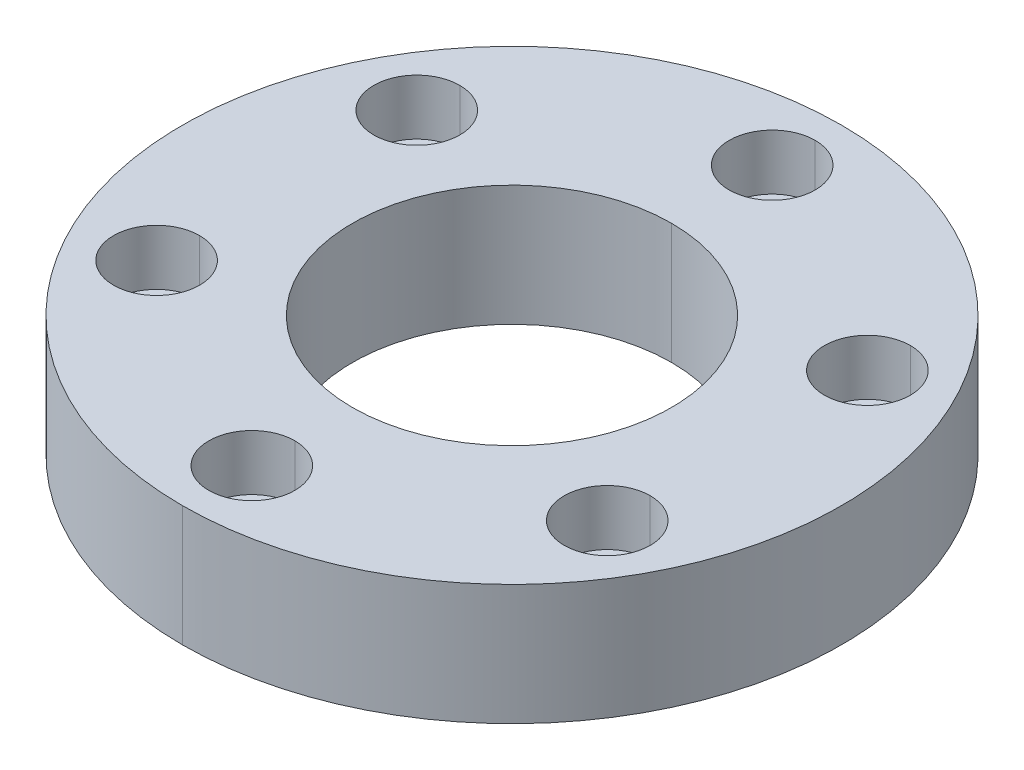
ISO-10303-21;
HEADER;
FILE_DESCRIPTION(('STEP AP214'),'2;1');
FILE_NAME('part.step','',(''),(''),'','','');
FILE_SCHEMA(('AUTOMOTIVE_DESIGN { 1 0 10303 214 1 1 1 1 }'));
ENDSEC;
DATA;
#1=APPLICATION_CONTEXT('core data for automotive mechanical design processes');
#2=APPLICATION_PROTOCOL_DEFINITION('international standard','automotive_design',2000,#1);
#3=PRODUCT_CONTEXT('',#1,'mechanical');
#4=PRODUCT('Part','Part','',(#3));
#5=PRODUCT_RELATED_PRODUCT_CATEGORY('part','',(#4));
#6=PRODUCT_DEFINITION_FORMATION('','',#4);
#7=PRODUCT_DEFINITION_CONTEXT('part definition',#1,'design');
#8=PRODUCT_DEFINITION('design','',#6,#7);
#9=PRODUCT_DEFINITION_SHAPE('','',#8);
#10=(LENGTH_UNIT() NAMED_UNIT(*) SI_UNIT(.MILLI.,.METRE.));
#11=(NAMED_UNIT(*) PLANE_ANGLE_UNIT() SI_UNIT($,.RADIAN.));
#12=(NAMED_UNIT(*) SI_UNIT($,.STERADIAN.) SOLID_ANGLE_UNIT());
#13=UNCERTAINTY_MEASURE_WITH_UNIT(LENGTH_MEASURE(1.E-05),#10,'distance_accuracy_value','');
#14=(GEOMETRIC_REPRESENTATION_CONTEXT(3) GLOBAL_UNCERTAINTY_ASSIGNED_CONTEXT((#13)) GLOBAL_UNIT_ASSIGNED_CONTEXT((#10,
#11,#12)) REPRESENTATION_CONTEXT('',''));
#15=CARTESIAN_POINT('',(0.,0.,0.));
#16=DIRECTION('',(0.,0.,1.));
#17=DIRECTION('',(1.,0.,0.));
#18=AXIS2_PLACEMENT_3D('',#15,#16,#17);
#19=CARTESIAN_POINT('',(0.,5.9563,-23.8125));
#20=DIRECTION('',(0.,1.,0.));
#21=DIRECTION('',(1.,0.,0.));
#22=AXIS2_PLACEMENT_3D('',#19,#20,#21);
#23=PLANE('',#22);
#24=CARTESIAN_POINT('',(0.,5.9563,-23.8125));
#25=DIRECTION('',(0.,1.,0.));
#26=DIRECTION('',(0.,0.,1.));
#27=AXIS2_PLACEMENT_3D('',#24,#25,#26);
#28=CIRCLE('',#27,3.937);
#29=CARTESIAN_POINT('',(0.,5.9563,-19.8755));
#30=VERTEX_POINT('',#29);
#31=CARTESIAN_POINT('',(0.,5.9563,-27.7495));
#32=VERTEX_POINT('',#31);
#33=EDGE_CURVE('E10',#30,#32,#28,.T.);
#34=ORIENTED_EDGE('',*,*,#33,.T.);
#35=CARTESIAN_POINT('',(0.,5.9563,-23.8125));
#36=DIRECTION('',(0.,1.,0.));
#37=DIRECTION('',(0.,0.,1.));
#38=AXIS2_PLACEMENT_3D('',#35,#36,#37);
#39=CIRCLE('',#38,3.937);
#40=EDGE_CURVE('E346',#32,#30,#39,.T.);
#41=ORIENTED_EDGE('',*,*,#40,.T.);
#42=EDGE_LOOP('',(#34,#41));
#43=FACE_BOUND('',#42,.T.);
#44=ADVANCED_FACE('F16',(#43),#23,.T.);
#45=CARTESIAN_POINT('',(0.,5.9563,-23.8125));
#46=DIRECTION('',(0.,1.,0.));
#47=DIRECTION('',(0.,0.,1.));
#48=AXIS2_PLACEMENT_3D('',#45,#46,#47);
#49=CYLINDRICAL_SURFACE('',#48,3.937);
#50=DIRECTION('',(0.,1.,0.));
#51=VECTOR('',#50,1.);
#52=CARTESIAN_POINT('',(0.,5.9563,-27.7495));
#53=LINE('',#52,#51);
#54=CARTESIAN_POINT('',(0.,11.0363,-27.7495));
#55=VERTEX_POINT('',#54);
#56=EDGE_CURVE('E218',#32,#55,#53,.T.);
#57=ORIENTED_EDGE('',*,*,#56,.F.);
#58=ORIENTED_EDGE('',*,*,#33,.F.);
#59=DIRECTION('',(0.,1.,0.));
#60=VECTOR('',#59,1.);
#61=CARTESIAN_POINT('',(0.,5.9563,-19.8755));
#62=LINE('',#61,#60);
#63=CARTESIAN_POINT('',(0.,11.0363,-19.8755));
#64=VERTEX_POINT('',#63);
#65=EDGE_CURVE('E205',#30,#64,#62,.T.);
#66=ORIENTED_EDGE('',*,*,#65,.T.);
#67=CARTESIAN_POINT('',(0.,11.0363,-23.8125));
#68=DIRECTION('',(0.,1.,0.));
#69=DIRECTION('',(0.,0.,1.));
#70=AXIS2_PLACEMENT_3D('',#67,#68,#69);
#71=CIRCLE('',#70,3.937);
#72=EDGE_CURVE('E82',#64,#55,#71,.T.);
#73=ORIENTED_EDGE('',*,*,#72,.T.);
#74=EDGE_LOOP('',(#57,#58,#66,#73));
#75=FACE_BOUND('',#74,.T.);
#76=ADVANCED_FACE('F409',(#75),#49,.F.);
#77=CARTESIAN_POINT('',(-20.6222299276169,5.9563,-11.90625));
#78=DIRECTION('',(0.,1.,0.));
#79=DIRECTION('',(1.,0.,0.));
#80=AXIS2_PLACEMENT_3D('',#77,#78,#79);
#81=PLANE('',#80);
#82=CARTESIAN_POINT('',(-20.6222299276169,5.9563,-11.90625));
#83=DIRECTION('',(0.,1.,0.));
#84=DIRECTION('',(0.,0.,1.));
#85=AXIS2_PLACEMENT_3D('',#82,#83,#84);
#86=CIRCLE('',#85,3.937);
#87=CARTESIAN_POINT('',(-20.6222299276169,5.9563,-7.96925));
#88=VERTEX_POINT('',#87);
#89=CARTESIAN_POINT('',(-20.6222299276169,5.9563,-15.84325));
#90=VERTEX_POINT('',#89);
#91=EDGE_CURVE('E27',#88,#90,#86,.T.);
#92=ORIENTED_EDGE('',*,*,#91,.T.);
#93=CARTESIAN_POINT('',(-20.6222299276169,5.9563,-11.90625));
#94=DIRECTION('',(0.,1.,0.));
#95=DIRECTION('',(0.,0.,1.));
#96=AXIS2_PLACEMENT_3D('',#93,#94,#95);
#97=CIRCLE('',#96,3.937);
#98=EDGE_CURVE('E197',#90,#88,#97,.T.);
#99=ORIENTED_EDGE('',*,*,#98,.T.);
#100=EDGE_LOOP('',(#92,#99));
#101=FACE_BOUND('',#100,.T.);
#102=ADVANCED_FACE('F203',(#101),#81,.T.);
#103=CARTESIAN_POINT('',(-20.6222299276169,5.9563,-11.90625));
#104=DIRECTION('',(0.,1.,0.));
#105=DIRECTION('',(0.,0.,1.));
#106=AXIS2_PLACEMENT_3D('',#103,#104,#105);
#107=CYLINDRICAL_SURFACE('',#106,3.937);
#108=DIRECTION('',(0.,1.,0.));
#109=VECTOR('',#108,1.);
#110=CARTESIAN_POINT('',(-20.6222299276169,5.9563,-15.84325));
#111=LINE('',#110,#109);
#112=CARTESIAN_POINT('',(-20.6222299276169,11.0363,-15.84325));
#113=VERTEX_POINT('',#112);
#114=EDGE_CURVE('E188',#90,#113,#111,.T.);
#115=ORIENTED_EDGE('',*,*,#114,.F.);
#116=ORIENTED_EDGE('',*,*,#91,.F.);
#117=DIRECTION('',(0.,1.,0.));
#118=VECTOR('',#117,1.);
#119=CARTESIAN_POINT('',(-20.6222299276169,5.9563,-7.96925));
#120=LINE('',#119,#118);
#121=CARTESIAN_POINT('',(-20.6222299276169,11.0363,-7.96925));
#122=VERTEX_POINT('',#121);
#123=EDGE_CURVE('E185',#88,#122,#120,.T.);
#124=ORIENTED_EDGE('',*,*,#123,.T.);
#125=CARTESIAN_POINT('',(-20.6222299276169,11.0363,-11.90625));
#126=DIRECTION('',(0.,1.,0.));
#127=DIRECTION('',(0.,0.,1.));
#128=AXIS2_PLACEMENT_3D('',#125,#126,#127);
#129=CIRCLE('',#128,3.937);
#130=EDGE_CURVE('E243',#122,#113,#129,.T.);
#131=ORIENTED_EDGE('',*,*,#130,.T.);
#132=EDGE_LOOP('',(#115,#116,#124,#131));
#133=FACE_BOUND('',#132,.T.);
#134=ADVANCED_FACE('F18',(#133),#107,.F.);
#135=CARTESIAN_POINT('',(-20.6222299276169,5.9563,11.90625));
#136=DIRECTION('',(0.,1.,0.));
#137=DIRECTION('',(1.,0.,0.));
#138=AXIS2_PLACEMENT_3D('',#135,#136,#137);
#139=PLANE('',#138);
#140=CARTESIAN_POINT('',(-20.6222299276169,5.9563,11.90625));
#141=DIRECTION('',(0.,1.,0.));
#142=DIRECTION('',(0.,0.,1.));
#143=AXIS2_PLACEMENT_3D('',#140,#141,#142);
#144=CIRCLE('',#143,3.937);
#145=CARTESIAN_POINT('',(-20.6222299276169,5.9563,15.84325));
#146=VERTEX_POINT('',#145);
#147=CARTESIAN_POINT('',(-20.6222299276169,5.9563,7.96925));
#148=VERTEX_POINT('',#147);
#149=EDGE_CURVE('E193',#146,#148,#144,.T.);
#150=ORIENTED_EDGE('',*,*,#149,.T.);
#151=CARTESIAN_POINT('',(-20.6222299276169,5.9563,11.90625));
#152=DIRECTION('',(0.,1.,0.));
#153=DIRECTION('',(0.,0.,1.));
#154=AXIS2_PLACEMENT_3D('',#151,#152,#153);
#155=CIRCLE('',#154,3.937);
#156=EDGE_CURVE('E201',#148,#146,#155,.T.);
#157=ORIENTED_EDGE('',*,*,#156,.T.);
#158=EDGE_LOOP('',(#150,#157));
#159=FACE_BOUND('',#158,.T.);
#160=ADVANCED_FACE('F550',(#159),#139,.T.);
#161=CARTESIAN_POINT('',(-20.6222299276169,5.9563,11.90625));
#162=DIRECTION('',(0.,1.,0.));
#163=DIRECTION('',(0.,0.,1.));
#164=AXIS2_PLACEMENT_3D('',#161,#162,#163);
#165=CYLINDRICAL_SURFACE('',#164,3.937);
#166=DIRECTION('',(0.,1.,0.));
#167=VECTOR('',#166,1.);
#168=CARTESIAN_POINT('',(-20.6222299276169,5.9563,7.96925));
#169=LINE('',#168,#167);
#170=CARTESIAN_POINT('',(-20.6222299276169,11.0363,7.96925));
#171=VERTEX_POINT('',#170);
#172=EDGE_CURVE('E237',#148,#171,#169,.T.);
#173=ORIENTED_EDGE('',*,*,#172,.F.);
#174=ORIENTED_EDGE('',*,*,#149,.F.);
#175=DIRECTION('',(0.,1.,0.));
#176=VECTOR('',#175,1.);
#177=CARTESIAN_POINT('',(-20.6222299276169,5.9563,15.84325));
#178=LINE('',#177,#176);
#179=CARTESIAN_POINT('',(-20.6222299276169,11.0363,15.84325));
#180=VERTEX_POINT('',#179);
#181=EDGE_CURVE('E236',#146,#180,#178,.T.);
#182=ORIENTED_EDGE('',*,*,#181,.T.);
#183=CARTESIAN_POINT('',(-20.6222299276169,11.0363,11.90625));
#184=DIRECTION('',(0.,1.,0.));
#185=DIRECTION('',(0.,0.,1.));
#186=AXIS2_PLACEMENT_3D('',#183,#184,#185);
#187=CIRCLE('',#186,3.937);
#188=EDGE_CURVE('E246',#180,#171,#187,.T.);
#189=ORIENTED_EDGE('',*,*,#188,.T.);
#190=EDGE_LOOP('',(#173,#174,#182,#189));
#191=FACE_BOUND('',#190,.T.);
#192=ADVANCED_FACE('F554',(#191),#165,.F.);
#193=CARTESIAN_POINT('',(0.,5.9563,23.8125));
#194=DIRECTION('',(0.,1.,0.));
#195=DIRECTION('',(1.,0.,0.));
#196=AXIS2_PLACEMENT_3D('',#193,#194,#195);
#197=PLANE('',#196);
#198=CARTESIAN_POINT('',(0.,5.9563,23.8125));
#199=DIRECTION('',(0.,1.,0.));
#200=DIRECTION('',(0.,0.,1.));
#201=AXIS2_PLACEMENT_3D('',#198,#199,#200);
#202=CIRCLE('',#201,3.937);
#203=CARTESIAN_POINT('',(0.,5.9563,27.7495));
#204=VERTEX_POINT('',#203);
#205=CARTESIAN_POINT('',(0.,5.9563,19.8755));
#206=VERTEX_POINT('',#205);
#207=EDGE_CURVE('E222',#204,#206,#202,.T.);
#208=ORIENTED_EDGE('',*,*,#207,.T.);
#209=CARTESIAN_POINT('',(0.,5.9563,23.8125));
#210=DIRECTION('',(0.,1.,0.));
#211=DIRECTION('',(0.,0.,1.));
#212=AXIS2_PLACEMENT_3D('',#209,#210,#211);
#213=CIRCLE('',#212,3.937);
#214=EDGE_CURVE('E299',#206,#204,#213,.T.);
#215=ORIENTED_EDGE('',*,*,#214,.T.);
#216=EDGE_LOOP('',(#208,#215));
#217=FACE_BOUND('',#216,.T.);
#218=ADVANCED_FACE('F590',(#217),#197,.T.);
#219=CARTESIAN_POINT('',(0.,5.9563,23.8125));
#220=DIRECTION('',(0.,1.,0.));
#221=DIRECTION('',(0.,0.,1.));
#222=AXIS2_PLACEMENT_3D('',#219,#220,#221);
#223=CYLINDRICAL_SURFACE('',#222,3.937);
#224=DIRECTION('',(0.,1.,0.));
#225=VECTOR('',#224,1.);
#226=CARTESIAN_POINT('',(0.,5.9563,19.8755));
#227=LINE('',#226,#225);
#228=CARTESIAN_POINT('',(0.,11.0363,19.8755));
#229=VERTEX_POINT('',#228);
#230=EDGE_CURVE('E228',#206,#229,#227,.T.);
#231=ORIENTED_EDGE('',*,*,#230,.F.);
#232=ORIENTED_EDGE('',*,*,#207,.F.);
#233=DIRECTION('',(0.,1.,0.));
#234=VECTOR('',#233,1.);
#235=CARTESIAN_POINT('',(0.,5.9563,27.7495));
#236=LINE('',#235,#234);
#237=CARTESIAN_POINT('',(0.,11.0363,27.7495));
#238=VERTEX_POINT('',#237);
#239=EDGE_CURVE('E227',#204,#238,#236,.T.);
#240=ORIENTED_EDGE('',*,*,#239,.T.);
#241=CARTESIAN_POINT('',(0.,11.0363,23.8125));
#242=DIRECTION('',(0.,1.,0.));
#243=DIRECTION('',(0.,0.,1.));
#244=AXIS2_PLACEMENT_3D('',#241,#242,#243);
#245=CIRCLE('',#244,3.937);
#246=EDGE_CURVE('E231',#238,#229,#245,.T.);
#247=ORIENTED_EDGE('',*,*,#246,.T.);
#248=EDGE_LOOP('',(#231,#232,#240,#247));
#249=FACE_BOUND('',#248,.T.);
#250=ADVANCED_FACE('F424',(#249),#223,.F.);
#251=CARTESIAN_POINT('',(20.6222299276169,5.9563,11.90625));
#252=DIRECTION('',(0.,1.,0.));
#253=DIRECTION('',(1.,0.,0.));
#254=AXIS2_PLACEMENT_3D('',#251,#252,#253);
#255=PLANE('',#254);
#256=CARTESIAN_POINT('',(20.6222299276169,5.9563,11.90625));
#257=DIRECTION('',(0.,1.,0.));
#258=DIRECTION('',(0.,0.,1.));
#259=AXIS2_PLACEMENT_3D('',#256,#257,#258);
#260=CIRCLE('',#259,3.937);
#261=CARTESIAN_POINT('',(20.6222299276169,5.9563,15.84325));
#262=VERTEX_POINT('',#261);
#263=CARTESIAN_POINT('',(20.6222299276169,5.9563,7.96925));
#264=VERTEX_POINT('',#263);
#265=EDGE_CURVE('E163',#262,#264,#260,.T.);
#266=ORIENTED_EDGE('',*,*,#265,.T.);
#267=CARTESIAN_POINT('',(20.6222299276169,5.9563,11.90625));
#268=DIRECTION('',(0.,1.,0.));
#269=DIRECTION('',(0.,0.,1.));
#270=AXIS2_PLACEMENT_3D('',#267,#268,#269);
#271=CIRCLE('',#270,3.937);
#272=EDGE_CURVE('E250',#264,#262,#271,.T.);
#273=ORIENTED_EDGE('',*,*,#272,.T.);
#274=EDGE_LOOP('',(#266,#273));
#275=FACE_BOUND('',#274,.T.);
#276=ADVANCED_FACE('F420',(#275),#255,.T.);
#277=CARTESIAN_POINT('',(20.6222299276169,5.9563,11.90625));
#278=DIRECTION('',(0.,1.,0.));
#279=DIRECTION('',(0.,0.,1.));
#280=AXIS2_PLACEMENT_3D('',#277,#278,#279);
#281=CYLINDRICAL_SURFACE('',#280,3.937);
#282=DIRECTION('',(0.,1.,0.));
#283=VECTOR('',#282,1.);
#284=CARTESIAN_POINT('',(20.6222299276169,5.9563,7.96925));
#285=LINE('',#284,#283);
#286=CARTESIAN_POINT('',(20.6222299276169,11.0363,7.96925));
#287=VERTEX_POINT('',#286);
#288=EDGE_CURVE('E281',#264,#287,#285,.T.);
#289=ORIENTED_EDGE('',*,*,#288,.F.);
#290=ORIENTED_EDGE('',*,*,#265,.F.);
#291=DIRECTION('',(0.,1.,0.));
#292=VECTOR('',#291,1.);
#293=CARTESIAN_POINT('',(20.6222299276169,5.9563,15.84325));
#294=LINE('',#293,#292);
#295=CARTESIAN_POINT('',(20.6222299276169,11.0363,15.84325));
#296=VERTEX_POINT('',#295);
#297=EDGE_CURVE('E238',#262,#296,#294,.T.);
#298=ORIENTED_EDGE('',*,*,#297,.T.);
#299=CARTESIAN_POINT('',(20.6222299276169,11.0363,11.90625));
#300=DIRECTION('',(0.,1.,0.));
#301=DIRECTION('',(0.,0.,1.));
#302=AXIS2_PLACEMENT_3D('',#299,#300,#301);
#303=CIRCLE('',#302,3.937);
#304=EDGE_CURVE('E152',#296,#287,#303,.T.);
#305=ORIENTED_EDGE('',*,*,#304,.T.);
#306=EDGE_LOOP('',(#289,#290,#298,#305));
#307=FACE_BOUND('',#306,.T.);
#308=ADVANCED_FACE('F423',(#307),#281,.F.);
#309=CARTESIAN_POINT('',(20.6222299276169,5.9563,-11.90625));
#310=DIRECTION('',(0.,1.,0.));
#311=DIRECTION('',(1.,0.,0.));
#312=AXIS2_PLACEMENT_3D('',#309,#310,#311);
#313=PLANE('',#312);
#314=CARTESIAN_POINT('',(20.6222299276169,5.9563,-11.90625));
#315=DIRECTION('',(0.,1.,0.));
#316=DIRECTION('',(0.,0.,1.));
#317=AXIS2_PLACEMENT_3D('',#314,#315,#316);
#318=CIRCLE('',#317,3.937);
#319=CARTESIAN_POINT('',(20.6222299276169,5.9563,-7.96925));
#320=VERTEX_POINT('',#319);
#321=CARTESIAN_POINT('',(20.6222299276169,5.9563,-15.84325));
#322=VERTEX_POINT('',#321);
#323=EDGE_CURVE('E264',#320,#322,#318,.T.);
#324=ORIENTED_EDGE('',*,*,#323,.T.);
#325=CARTESIAN_POINT('',(20.6222299276169,5.9563,-11.90625));
#326=DIRECTION('',(0.,1.,0.));
#327=DIRECTION('',(0.,0.,1.));
#328=AXIS2_PLACEMENT_3D('',#325,#326,#327);
#329=CIRCLE('',#328,3.937);
#330=EDGE_CURVE('E241',#322,#320,#329,.T.);
#331=ORIENTED_EDGE('',*,*,#330,.T.);
#332=EDGE_LOOP('',(#324,#331));
#333=FACE_BOUND('',#332,.T.);
#334=ADVANCED_FACE('F434',(#333),#313,.T.);
#335=CARTESIAN_POINT('',(20.6222299276169,5.9563,-11.90625));
#336=DIRECTION('',(0.,1.,0.));
#337=DIRECTION('',(0.,0.,1.));
#338=AXIS2_PLACEMENT_3D('',#335,#336,#337);
#339=CYLINDRICAL_SURFACE('',#338,3.937);
#340=DIRECTION('',(0.,1.,0.));
#341=VECTOR('',#340,1.);
#342=CARTESIAN_POINT('',(20.6222299276169,5.9563,-15.84325));
#343=LINE('',#342,#341);
#344=CARTESIAN_POINT('',(20.6222299276169,11.0363,-15.84325));
#345=VERTEX_POINT('',#344);
#346=EDGE_CURVE('E254',#322,#345,#343,.T.);
#347=ORIENTED_EDGE('',*,*,#346,.F.);
#348=ORIENTED_EDGE('',*,*,#323,.F.);
#349=DIRECTION('',(0.,1.,0.));
#350=VECTOR('',#349,1.);
#351=CARTESIAN_POINT('',(20.6222299276169,5.9563,-7.96925));
#352=LINE('',#351,#350);
#353=CARTESIAN_POINT('',(20.6222299276169,11.0363,-7.96925));
#354=VERTEX_POINT('',#353);
#355=EDGE_CURVE('E255',#320,#354,#352,.T.);
#356=ORIENTED_EDGE('',*,*,#355,.T.);
#357=CARTESIAN_POINT('',(20.6222299276169,11.0363,-11.90625));
#358=DIRECTION('',(0.,1.,0.));
#359=DIRECTION('',(0.,0.,1.));
#360=AXIS2_PLACEMENT_3D('',#357,#358,#359);
#361=CIRCLE('',#360,3.937);
#362=EDGE_CURVE('E112',#354,#345,#361,.T.);
#363=ORIENTED_EDGE('',*,*,#362,.T.);
#364=EDGE_LOOP('',(#347,#348,#356,#363));
#365=FACE_BOUND('',#364,.T.);
#366=ADVANCED_FACE('F438',(#365),#339,.F.);
#367=CARTESIAN_POINT('',(0.,11.0363,0.));
#368=DIRECTION('',(0.,-1.,0.));
#369=DIRECTION('',(0.,0.,-1.));
#370=AXIS2_PLACEMENT_3D('',#367,#368,#369);
#371=CYLINDRICAL_SURFACE('',#370,14.605);
#372=DIRECTION('',(0.,-1.,0.));
#373=VECTOR('',#372,1.);
#374=CARTESIAN_POINT('',(0.,11.0363,14.605));
#375=LINE('',#374,#373);
#376=CARTESIAN_POINT('',(0.,11.0363,14.605));
#377=VERTEX_POINT('',#376);
#378=CARTESIAN_POINT('',(0.,0.,14.605));
#379=VERTEX_POINT('',#378);
#380=EDGE_CURVE('E263',#377,#379,#375,.T.);
#381=ORIENTED_EDGE('',*,*,#380,.F.);
#382=CARTESIAN_POINT('',(0.,11.0363,0.));
#383=DIRECTION('',(0.,1.,0.));
#384=DIRECTION('',(0.,0.,1.));
#385=AXIS2_PLACEMENT_3D('',#382,#383,#384);
#386=CIRCLE('',#385,14.605);
#387=CARTESIAN_POINT('',(0.,11.0363,-14.605));
#388=VERTEX_POINT('',#387);
#389=EDGE_CURVE('E303',#377,#388,#386,.T.);
#390=ORIENTED_EDGE('',*,*,#389,.T.);
#391=DIRECTION('',(0.,-1.,0.));
#392=VECTOR('',#391,1.);
#393=CARTESIAN_POINT('',(0.,11.0363,-14.605));
#394=LINE('',#393,#392);
#395=CARTESIAN_POINT('',(0.,0.,-14.605));
#396=VERTEX_POINT('',#395);
#397=EDGE_CURVE('E291',#388,#396,#394,.T.);
#398=ORIENTED_EDGE('',*,*,#397,.T.);
#399=CARTESIAN_POINT('',(0.,0.,0.));
#400=DIRECTION('',(0.,1.,0.));
#401=DIRECTION('',(0.,0.,1.));
#402=AXIS2_PLACEMENT_3D('',#399,#400,#401);
#403=CIRCLE('',#402,14.605);
#404=EDGE_CURVE('E20',#379,#396,#403,.T.);
#405=ORIENTED_EDGE('',*,*,#404,.F.);
#406=EDGE_LOOP('',(#381,#390,#398,#405));
#407=FACE_BOUND('',#406,.T.);
#408=ADVANCED_FACE('F581',(#407),#371,.F.);
#409=CARTESIAN_POINT('',(0.,11.0363,0.));
#410=DIRECTION('',(0.,-1.,0.));
#411=DIRECTION('',(0.,0.,-1.));
#412=AXIS2_PLACEMENT_3D('',#409,#410,#411);
#413=CYLINDRICAL_SURFACE('',#412,30.1625);
#414=DIRECTION('',(0.,-1.,0.));
#415=VECTOR('',#414,1.);
#416=CARTESIAN_POINT('',(0.,11.0363,30.1625));
#417=LINE('',#416,#415);
#418=CARTESIAN_POINT('',(0.,11.0363,30.1625));
#419=VERTEX_POINT('',#418);
#420=CARTESIAN_POINT('',(0.,0.,30.1625));
#421=VERTEX_POINT('',#420);
#422=EDGE_CURVE('E273',#419,#421,#417,.T.);
#423=ORIENTED_EDGE('',*,*,#422,.F.);
#424=CARTESIAN_POINT('',(0.,11.0363,0.));
#425=DIRECTION('',(0.,1.,0.));
#426=DIRECTION('',(0.,0.,1.));
#427=AXIS2_PLACEMENT_3D('',#424,#425,#426);
#428=CIRCLE('',#427,30.1625);
#429=CARTESIAN_POINT('',(0.,11.0363,-30.1625));
#430=VERTEX_POINT('',#429);
#431=EDGE_CURVE('E325',#430,#419,#428,.T.);
#432=ORIENTED_EDGE('',*,*,#431,.F.);
#433=DIRECTION('',(0.,-1.,0.));
#434=VECTOR('',#433,1.);
#435=CARTESIAN_POINT('',(0.,11.0363,-30.1625));
#436=LINE('',#435,#434);
#437=CARTESIAN_POINT('',(0.,0.,-30.1625));
#438=VERTEX_POINT('',#437);
#439=EDGE_CURVE('E272',#430,#438,#436,.T.);
#440=ORIENTED_EDGE('',*,*,#439,.T.);
#441=CARTESIAN_POINT('',(0.,0.,0.));
#442=DIRECTION('',(0.,1.,0.));
#443=DIRECTION('',(0.,0.,1.));
#444=AXIS2_PLACEMENT_3D('',#441,#442,#443);
#445=CIRCLE('',#444,30.1625);
#446=EDGE_CURVE('E41',#438,#421,#445,.T.);
#447=ORIENTED_EDGE('',*,*,#446,.T.);
#448=EDGE_LOOP('',(#423,#432,#440,#447));
#449=FACE_BOUND('',#448,.T.);
#450=ADVANCED_FACE('F374',(#449),#413,.T.);
#451=CARTESIAN_POINT('',(0.,0.,0.));
#452=DIRECTION('',(0.,1.,0.));
#453=DIRECTION('',(1.,0.,0.));
#454=AXIS2_PLACEMENT_3D('',#451,#452,#453);
#455=PLANE('',#454);
#456=CARTESIAN_POINT('',(0.,0.,0.));
#457=DIRECTION('',(0.,1.,0.));
#458=DIRECTION('',(0.,0.,1.));
#459=AXIS2_PLACEMENT_3D('',#456,#457,#458);
#460=CIRCLE('',#459,14.605);
#461=EDGE_CURVE('E280',#396,#379,#460,.T.);
#462=ORIENTED_EDGE('',*,*,#461,.T.);
#463=ORIENTED_EDGE('',*,*,#404,.T.);
#464=EDGE_LOOP('',(#462,#463));
#465=FACE_BOUND('',#464,.T.);
#466=ORIENTED_EDGE('',*,*,#446,.F.);
#467=CARTESIAN_POINT('',(0.,0.,0.));
#468=DIRECTION('',(0.,1.,0.));
#469=DIRECTION('',(0.,0.,1.));
#470=AXIS2_PLACEMENT_3D('',#467,#468,#469);
#471=CIRCLE('',#470,30.1625);
#472=EDGE_CURVE('E268',#421,#438,#471,.T.);
#473=ORIENTED_EDGE('',*,*,#472,.F.);
#474=EDGE_LOOP('',(#466,#473));
#475=FACE_BOUND('',#474,.T.);
#476=ADVANCED_FACE('F393',(#465,#475),#455,.F.);
#477=CARTESIAN_POINT('',(0.,11.0363,0.));
#478=DIRECTION('',(0.,1.,0.));
#479=DIRECTION('',(1.,0.,0.));
#480=AXIS2_PLACEMENT_3D('',#477,#478,#479);
#481=PLANE('',#480);
#482=CARTESIAN_POINT('',(0.,11.0363,0.));
#483=DIRECTION('',(0.,1.,0.));
#484=DIRECTION('',(0.,0.,1.));
#485=AXIS2_PLACEMENT_3D('',#482,#483,#484);
#486=CIRCLE('',#485,14.605);
#487=EDGE_CURVE('E258',#388,#377,#486,.T.);
#488=ORIENTED_EDGE('',*,*,#487,.F.);
#489=ORIENTED_EDGE('',*,*,#389,.F.);
#490=EDGE_LOOP('',(#488,#489));
#491=FACE_BOUND('',#490,.T.);
#492=ORIENTED_EDGE('',*,*,#362,.F.);
#493=CARTESIAN_POINT('',(20.6222299276169,11.0363,-11.90625));
#494=DIRECTION('',(0.,1.,0.));
#495=DIRECTION('',(0.,0.,1.));
#496=AXIS2_PLACEMENT_3D('',#493,#494,#495);
#497=CIRCLE('',#496,3.937);
#498=EDGE_CURVE('E259',#345,#354,#497,.T.);
#499=ORIENTED_EDGE('',*,*,#498,.F.);
#500=EDGE_LOOP('',(#492,#499));
#501=FACE_BOUND('',#500,.T.);
#502=ORIENTED_EDGE('',*,*,#304,.F.);
#503=CARTESIAN_POINT('',(20.6222299276169,11.0363,11.90625));
#504=DIRECTION('',(0.,1.,0.));
#505=DIRECTION('',(0.,0.,1.));
#506=AXIS2_PLACEMENT_3D('',#503,#504,#505);
#507=CIRCLE('',#506,3.937);
#508=EDGE_CURVE('E242',#287,#296,#507,.T.);
#509=ORIENTED_EDGE('',*,*,#508,.F.);
#510=EDGE_LOOP('',(#502,#509));
#511=FACE_BOUND('',#510,.T.);
#512=ORIENTED_EDGE('',*,*,#246,.F.);
#513=CARTESIAN_POINT('',(0.,11.0363,23.8125));
#514=DIRECTION('',(0.,1.,0.));
#515=DIRECTION('',(0.,0.,1.));
#516=AXIS2_PLACEMENT_3D('',#513,#514,#515);
#517=CIRCLE('',#516,3.937);
#518=EDGE_CURVE('E223',#229,#238,#517,.T.);
#519=ORIENTED_EDGE('',*,*,#518,.F.);
#520=EDGE_LOOP('',(#512,#519));
#521=FACE_BOUND('',#520,.T.);
#522=ORIENTED_EDGE('',*,*,#188,.F.);
#523=CARTESIAN_POINT('',(-20.6222299276169,11.0363,11.90625));
#524=DIRECTION('',(0.,1.,0.));
#525=DIRECTION('',(0.,0.,1.));
#526=AXIS2_PLACEMENT_3D('',#523,#524,#525);
#527=CIRCLE('',#526,3.937);
#528=EDGE_CURVE('E232',#171,#180,#527,.T.);
#529=ORIENTED_EDGE('',*,*,#528,.F.);
#530=EDGE_LOOP('',(#522,#529));
#531=FACE_BOUND('',#530,.T.);
#532=ORIENTED_EDGE('',*,*,#130,.F.);
#533=CARTESIAN_POINT('',(-20.6222299276169,11.0363,-11.90625));
#534=DIRECTION('',(0.,1.,0.));
#535=DIRECTION('',(0.,0.,1.));
#536=AXIS2_PLACEMENT_3D('',#533,#534,#535);
#537=CIRCLE('',#536,3.937);
#538=EDGE_CURVE('E199',#113,#122,#537,.T.);
#539=ORIENTED_EDGE('',*,*,#538,.F.);
#540=EDGE_LOOP('',(#532,#539));
#541=FACE_BOUND('',#540,.T.);
#542=ORIENTED_EDGE('',*,*,#72,.F.);
#543=CARTESIAN_POINT('',(0.,11.0363,-23.8125));
#544=DIRECTION('',(0.,1.,0.));
#545=DIRECTION('',(0.,0.,1.));
#546=AXIS2_PLACEMENT_3D('',#543,#544,#545);
#547=CIRCLE('',#546,3.937);
#548=EDGE_CURVE('E214',#55,#64,#547,.T.);
#549=ORIENTED_EDGE('',*,*,#548,.F.);
#550=EDGE_LOOP('',(#542,#549));
#551=FACE_BOUND('',#550,.T.);
#552=ORIENTED_EDGE('',*,*,#431,.T.);
#553=CARTESIAN_POINT('',(0.,11.0363,0.));
#554=DIRECTION('',(0.,1.,0.));
#555=DIRECTION('',(0.,0.,1.));
#556=AXIS2_PLACEMENT_3D('',#553,#554,#555);
#557=CIRCLE('',#556,30.1625);
#558=EDGE_CURVE('E295',#419,#430,#557,.T.);
#559=ORIENTED_EDGE('',*,*,#558,.T.);
#560=EDGE_LOOP('',(#552,#559));
#561=FACE_BOUND('',#560,.T.);
#562=ADVANCED_FACE('F391',(#491,#501,#511,#521,#531,#541,#551,#561),#481,.T.);
#563=CARTESIAN_POINT('',(0.,11.0363,0.));
#564=DIRECTION('',(0.,-1.,0.));
#565=DIRECTION('',(0.,0.,-1.));
#566=AXIS2_PLACEMENT_3D('',#563,#564,#565);
#567=CYLINDRICAL_SURFACE('',#566,30.1625);
#568=ORIENTED_EDGE('',*,*,#558,.F.);
#569=ORIENTED_EDGE('',*,*,#422,.T.);
#570=ORIENTED_EDGE('',*,*,#472,.T.);
#571=ORIENTED_EDGE('',*,*,#439,.F.);
#572=EDGE_LOOP('',(#568,#569,#570,#571));
#573=FACE_BOUND('',#572,.T.);
#574=ADVANCED_FACE('F373',(#573),#567,.T.);
#575=CARTESIAN_POINT('',(0.,11.0363,0.));
#576=DIRECTION('',(0.,-1.,0.));
#577=DIRECTION('',(0.,0.,-1.));
#578=AXIS2_PLACEMENT_3D('',#575,#576,#577);
#579=CYLINDRICAL_SURFACE('',#578,14.605);
#580=ORIENTED_EDGE('',*,*,#487,.T.);
#581=ORIENTED_EDGE('',*,*,#380,.T.);
#582=ORIENTED_EDGE('',*,*,#461,.F.);
#583=ORIENTED_EDGE('',*,*,#397,.F.);
#584=EDGE_LOOP('',(#580,#581,#582,#583));
#585=FACE_BOUND('',#584,.T.);
#586=ADVANCED_FACE('F401',(#585),#579,.F.);
#587=CARTESIAN_POINT('',(20.6222299276169,5.9563,-11.90625));
#588=DIRECTION('',(0.,1.,0.));
#589=DIRECTION('',(0.,0.,1.));
#590=AXIS2_PLACEMENT_3D('',#587,#588,#589);
#591=CYLINDRICAL_SURFACE('',#590,3.937);
#592=ORIENTED_EDGE('',*,*,#330,.F.);
#593=ORIENTED_EDGE('',*,*,#346,.T.);
#594=ORIENTED_EDGE('',*,*,#498,.T.);
#595=ORIENTED_EDGE('',*,*,#355,.F.);
#596=EDGE_LOOP('',(#592,#593,#594,#595));
#597=FACE_BOUND('',#596,.T.);
#598=ADVANCED_FACE('F545',(#597),#591,.F.);
#599=CARTESIAN_POINT('',(20.6222299276169,5.9563,11.90625));
#600=DIRECTION('',(0.,1.,0.));
#601=DIRECTION('',(0.,0.,1.));
#602=AXIS2_PLACEMENT_3D('',#599,#600,#601);
#603=CYLINDRICAL_SURFACE('',#602,3.937);
#604=ORIENTED_EDGE('',*,*,#272,.F.);
#605=ORIENTED_EDGE('',*,*,#288,.T.);
#606=ORIENTED_EDGE('',*,*,#508,.T.);
#607=ORIENTED_EDGE('',*,*,#297,.F.);
#608=EDGE_LOOP('',(#604,#605,#606,#607));
#609=FACE_BOUND('',#608,.T.);
#610=ADVANCED_FACE('F429',(#609),#603,.F.);
#611=CARTESIAN_POINT('',(0.,5.9563,23.8125));
#612=DIRECTION('',(0.,1.,0.));
#613=DIRECTION('',(0.,0.,1.));
#614=AXIS2_PLACEMENT_3D('',#611,#612,#613);
#615=CYLINDRICAL_SURFACE('',#614,3.937);
#616=ORIENTED_EDGE('',*,*,#214,.F.);
#617=ORIENTED_EDGE('',*,*,#230,.T.);
#618=ORIENTED_EDGE('',*,*,#518,.T.);
#619=ORIENTED_EDGE('',*,*,#239,.F.);
#620=EDGE_LOOP('',(#616,#617,#618,#619));
#621=FACE_BOUND('',#620,.T.);
#622=ADVANCED_FACE('F425',(#621),#615,.F.);
#623=CARTESIAN_POINT('',(-20.6222299276169,5.9563,11.90625));
#624=DIRECTION('',(0.,1.,0.));
#625=DIRECTION('',(0.,0.,1.));
#626=AXIS2_PLACEMENT_3D('',#623,#624,#625);
#627=CYLINDRICAL_SURFACE('',#626,3.937);
#628=ORIENTED_EDGE('',*,*,#156,.F.);
#629=ORIENTED_EDGE('',*,*,#172,.T.);
#630=ORIENTED_EDGE('',*,*,#528,.T.);
#631=ORIENTED_EDGE('',*,*,#181,.F.);
#632=EDGE_LOOP('',(#628,#629,#630,#631));
#633=FACE_BOUND('',#632,.T.);
#634=ADVANCED_FACE('F428',(#633),#627,.F.);
#635=CARTESIAN_POINT('',(-20.6222299276169,5.9563,-11.90625));
#636=DIRECTION('',(0.,1.,0.));
#637=DIRECTION('',(0.,0.,1.));
#638=AXIS2_PLACEMENT_3D('',#635,#636,#637);
#639=CYLINDRICAL_SURFACE('',#638,3.937);
#640=ORIENTED_EDGE('',*,*,#98,.F.);
#641=ORIENTED_EDGE('',*,*,#114,.T.);
#642=ORIENTED_EDGE('',*,*,#538,.T.);
#643=ORIENTED_EDGE('',*,*,#123,.F.);
#644=EDGE_LOOP('',(#640,#641,#642,#643));
#645=FACE_BOUND('',#644,.T.);
#646=ADVANCED_FACE('F196',(#645),#639,.F.);
#647=CARTESIAN_POINT('',(0.,5.9563,-23.8125));
#648=DIRECTION('',(0.,1.,0.));
#649=DIRECTION('',(0.,0.,1.));
#650=AXIS2_PLACEMENT_3D('',#647,#648,#649);
#651=CYLINDRICAL_SURFACE('',#650,3.937);
#652=ORIENTED_EDGE('',*,*,#40,.F.);
#653=ORIENTED_EDGE('',*,*,#56,.T.);
#654=ORIENTED_EDGE('',*,*,#548,.T.);
#655=ORIENTED_EDGE('',*,*,#65,.F.);
#656=EDGE_LOOP('',(#652,#653,#654,#655));
#657=FACE_BOUND('',#656,.T.);
#658=ADVANCED_FACE('F418',(#657),#651,.F.);
#659=CLOSED_SHELL('',(#44,#76,#102,#134,#160,#192,#218,#250,#276,#308,#334,#366,#408,#450,#476,
#562,#574,#586,#598,#610,#622,#634,#646,#658));
#660=MANIFOLD_SOLID_BREP('B1',#659);
#661=ADVANCED_BREP_SHAPE_REPRESENTATION('',(#18,#660),#14);
#662=SHAPE_DEFINITION_REPRESENTATION(#9,#661);
ENDSEC;
END-ISO-10303-21;
